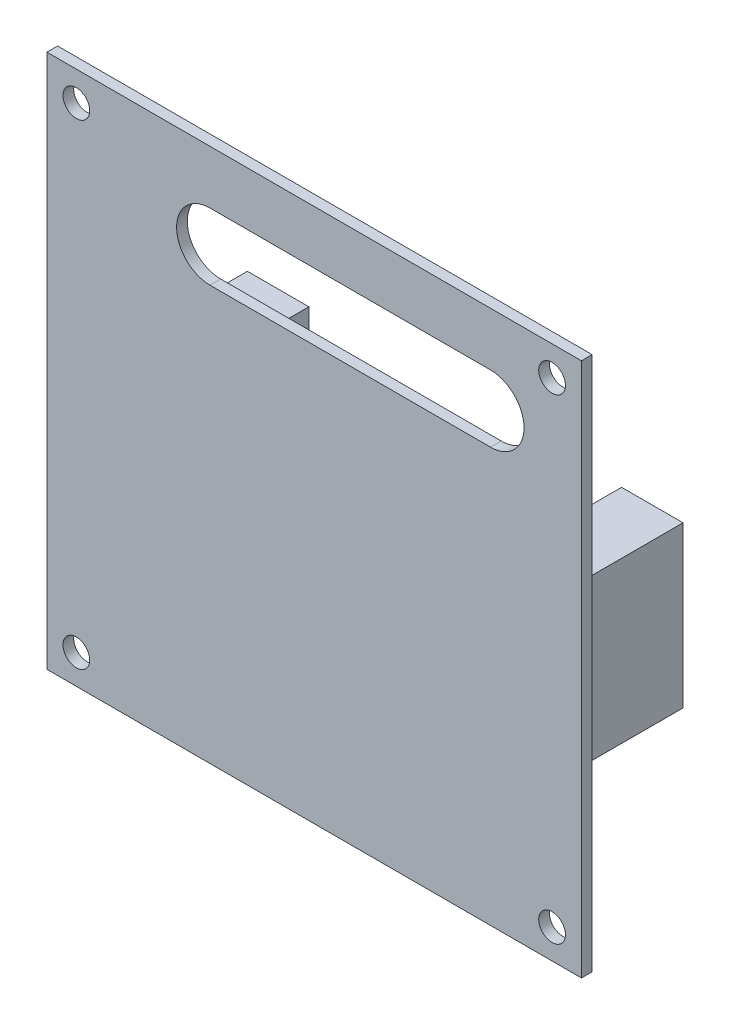
ISO-10303-21;
HEADER;
FILE_DESCRIPTION(('STEP AP214'),'2;1');
FILE_NAME('part.step','',(''),(''),'','','');
FILE_SCHEMA(('AUTOMOTIVE_DESIGN { 1 0 10303 214 1 1 1 1 }'));
ENDSEC;
DATA;
#1=APPLICATION_CONTEXT('core data for automotive mechanical design processes');
#2=APPLICATION_PROTOCOL_DEFINITION('international standard','automotive_design',2000,#1);
#3=PRODUCT_CONTEXT('',#1,'mechanical');
#4=PRODUCT('Part','Part','',(#3));
#5=PRODUCT_RELATED_PRODUCT_CATEGORY('part','',(#4));
#6=PRODUCT_DEFINITION_FORMATION('','',#4);
#7=PRODUCT_DEFINITION_CONTEXT('part definition',#1,'design');
#8=PRODUCT_DEFINITION('design','',#6,#7);
#9=PRODUCT_DEFINITION_SHAPE('','',#8);
#10=(LENGTH_UNIT() NAMED_UNIT(*) SI_UNIT(.MILLI.,.METRE.));
#11=(NAMED_UNIT(*) PLANE_ANGLE_UNIT() SI_UNIT($,.RADIAN.));
#12=(NAMED_UNIT(*) SI_UNIT($,.STERADIAN.) SOLID_ANGLE_UNIT());
#13=UNCERTAINTY_MEASURE_WITH_UNIT(LENGTH_MEASURE(1.E-05),#10,'distance_accuracy_value','');
#14=(GEOMETRIC_REPRESENTATION_CONTEXT(3) GLOBAL_UNCERTAINTY_ASSIGNED_CONTEXT((#13)) GLOBAL_UNIT_ASSIGNED_CONTEXT((#10,
#11,#12)) REPRESENTATION_CONTEXT('',''));
#15=CARTESIAN_POINT('',(0.,0.,0.));
#16=DIRECTION('',(0.,0.,1.));
#17=DIRECTION('',(1.,0.,0.));
#18=AXIS2_PLACEMENT_3D('',#15,#16,#17);
#19=CARTESIAN_POINT('',(0.,19.93096292877,0.8));
#20=DIRECTION('',(0.,-1.,0.));
#21=DIRECTION('',(1.,0.,0.));
#22=AXIS2_PLACEMENT_3D('',#19,#20,#21);
#23=PLANE('',#22);
#24=DIRECTION('',(-1.,0.,0.));
#25=VECTOR('',#24,1.);
#26=CARTESIAN_POINT('',(0.,19.93096292877,0.));
#27=LINE('',#26,#25);
#28=CARTESIAN_POINT('',(20.0625520294404,19.93096292877,0.));
#29=VERTEX_POINT('',#28);
#30=CARTESIAN_POINT('',(-19.9374479705597,19.93096292877,0.));
#31=VERTEX_POINT('',#30);
#32=EDGE_CURVE('E279',#29,#31,#27,.T.);
#33=ORIENTED_EDGE('',*,*,#32,.T.);
#34=DIRECTION('',(0.,0.,-1.));
#35=VECTOR('',#34,1.);
#36=CARTESIAN_POINT('',(-19.9374479705597,19.93096292877,0.8));
#37=LINE('',#36,#35);
#38=CARTESIAN_POINT('',(-19.9374479705597,19.93096292877,0.8));
#39=VERTEX_POINT('',#38);
#40=EDGE_CURVE('E295',#39,#31,#37,.T.);
#41=ORIENTED_EDGE('',*,*,#40,.F.);
#42=DIRECTION('',(-1.,0.,0.));
#43=VECTOR('',#42,1.);
#44=CARTESIAN_POINT('',(0.,19.93096292877,0.8));
#45=LINE('',#44,#43);
#46=CARTESIAN_POINT('',(20.0625520294404,19.93096292877,0.8));
#47=VERTEX_POINT('',#46);
#48=EDGE_CURVE('E258',#47,#39,#45,.T.);
#49=ORIENTED_EDGE('',*,*,#48,.F.);
#50=DIRECTION('',(0.,0.,-1.));
#51=VECTOR('',#50,1.);
#52=CARTESIAN_POINT('',(20.0625520294404,19.93096292877,0.8));
#53=LINE('',#52,#51);
#54=EDGE_CURVE('E267',#47,#29,#53,.T.);
#55=ORIENTED_EDGE('',*,*,#54,.T.);
#56=EDGE_LOOP('',(#33,#41,#49,#55));
#57=FACE_BOUND('',#56,.T.);
#58=ADVANCED_FACE('F38',(#57),#23,.F.);
#59=CARTESIAN_POINT('',(-19.9374479705597,0.,0.8));
#60=DIRECTION('',(1.,0.,0.));
#61=DIRECTION('',(0.,1.,0.));
#62=AXIS2_PLACEMENT_3D('',#59,#60,#61);
#63=PLANE('',#62);
#64=DIRECTION('',(0.,-1.,0.));
#65=VECTOR('',#64,1.);
#66=CARTESIAN_POINT('',(-19.9374479705597,0.,0.));
#67=LINE('',#66,#65);
#68=CARTESIAN_POINT('',(-19.9374479705597,-20.06903707123,0.));
#69=VERTEX_POINT('',#68);
#70=EDGE_CURVE('E282',#31,#69,#67,.T.);
#71=ORIENTED_EDGE('',*,*,#70,.T.);
#72=DIRECTION('',(0.,0.,-1.));
#73=VECTOR('',#72,1.);
#74=CARTESIAN_POINT('',(-19.9374479705597,-20.06903707123,0.8));
#75=LINE('',#74,#73);
#76=CARTESIAN_POINT('',(-19.9374479705597,-20.06903707123,0.8));
#77=VERTEX_POINT('',#76);
#78=EDGE_CURVE('E292',#77,#69,#75,.T.);
#79=ORIENTED_EDGE('',*,*,#78,.F.);
#80=DIRECTION('',(0.,-1.,0.));
#81=VECTOR('',#80,1.);
#82=CARTESIAN_POINT('',(-19.9374479705597,0.,0.8));
#83=LINE('',#82,#81);
#84=EDGE_CURVE('E261',#39,#77,#83,.T.);
#85=ORIENTED_EDGE('',*,*,#84,.F.);
#86=ORIENTED_EDGE('',*,*,#40,.T.);
#87=EDGE_LOOP('',(#71,#79,#85,#86));
#88=FACE_BOUND('',#87,.T.);
#89=ADVANCED_FACE('F345',(#88),#63,.F.);
#90=CARTESIAN_POINT('',(0.,-20.06903707123,0.8));
#91=DIRECTION('',(0.,1.,0.));
#92=DIRECTION('',(-1.,0.,0.));
#93=AXIS2_PLACEMENT_3D('',#90,#91,#92);
#94=PLANE('',#93);
#95=DIRECTION('',(1.,0.,0.));
#96=VECTOR('',#95,1.);
#97=CARTESIAN_POINT('',(0.,-20.06903707123,0.));
#98=LINE('',#97,#96);
#99=CARTESIAN_POINT('',(20.0625520294403,-20.06903707123,0.));
#100=VERTEX_POINT('',#99);
#101=EDGE_CURVE('E284',#69,#100,#98,.T.);
#102=ORIENTED_EDGE('',*,*,#101,.T.);
#103=DIRECTION('',(0.,0.,-1.));
#104=VECTOR('',#103,1.);
#105=CARTESIAN_POINT('',(20.0625520294403,-20.06903707123,0.8));
#106=LINE('',#105,#104);
#107=CARTESIAN_POINT('',(20.0625520294403,-20.06903707123,0.8));
#108=VERTEX_POINT('',#107);
#109=EDGE_CURVE('E289',#108,#100,#106,.T.);
#110=ORIENTED_EDGE('',*,*,#109,.F.);
#111=DIRECTION('',(1.,0.,0.));
#112=VECTOR('',#111,1.);
#113=CARTESIAN_POINT('',(0.,-20.06903707123,0.8));
#114=LINE('',#113,#112);
#115=EDGE_CURVE('E263',#77,#108,#114,.T.);
#116=ORIENTED_EDGE('',*,*,#115,.F.);
#117=ORIENTED_EDGE('',*,*,#78,.T.);
#118=EDGE_LOOP('',(#102,#110,#116,#117));
#119=FACE_BOUND('',#118,.T.);
#120=ADVANCED_FACE('F351',(#119),#94,.F.);
#121=CARTESIAN_POINT('',(-17.7374479705597,-17.86903707123,0.8));
#122=DIRECTION('',(0.,0.,-1.));
#123=DIRECTION('',(-1.,0.,0.));
#124=AXIS2_PLACEMENT_3D('',#121,#122,#123);
#125=CYLINDRICAL_SURFACE('',#124,0.999999999998721);
#126=CARTESIAN_POINT('',(-17.7374479705597,-17.86903707123,0.8));
#127=DIRECTION('',(0.,0.,1.));
#128=DIRECTION('',(1.,0.,0.));
#129=AXIS2_PLACEMENT_3D('',#126,#127,#128);
#130=CIRCLE('',#129,0.999999999998721);
#131=CARTESIAN_POINT('',(-16.7374479705609,-17.86903707123,0.8));
#132=VERTEX_POINT('',#131);
#133=EDGE_CURVE('E255',#132,#132,#130,.T.);
#134=ORIENTED_EDGE('',*,*,#133,.T.);
#135=EDGE_LOOP('',(#134));
#136=FACE_BOUND('',#135,.T.);
#137=CARTESIAN_POINT('',(-17.7374479705597,-17.86903707123,0.));
#138=DIRECTION('',(0.,0.,1.));
#139=DIRECTION('',(1.,0.,0.));
#140=AXIS2_PLACEMENT_3D('',#137,#138,#139);
#141=CIRCLE('',#140,0.999999999998721);
#142=CARTESIAN_POINT('',(-16.7374479705609,-17.86903707123,0.));
#143=VERTEX_POINT('',#142);
#144=EDGE_CURVE('E276',#143,#143,#141,.T.);
#145=ORIENTED_EDGE('',*,*,#144,.F.);
#146=EDGE_LOOP('',(#145));
#147=FACE_BOUND('',#146,.T.);
#148=ADVANCED_FACE('F356',(#136,#147),#125,.F.);
#149=CARTESIAN_POINT('',(-17.7374479705597,17.73096292877,0.8));
#150=DIRECTION('',(0.,0.,-1.));
#151=DIRECTION('',(-1.,0.,0.));
#152=AXIS2_PLACEMENT_3D('',#149,#150,#151);
#153=CYLINDRICAL_SURFACE('',#152,0.999999999998721);
#154=CARTESIAN_POINT('',(-17.7374479705597,17.73096292877,0.8));
#155=DIRECTION('',(0.,0.,1.));
#156=DIRECTION('',(1.,0.,0.));
#157=AXIS2_PLACEMENT_3D('',#154,#155,#156);
#158=CIRCLE('',#157,0.999999999998721);
#159=CARTESIAN_POINT('',(-16.737447970561,17.73096292877,0.8));
#160=VERTEX_POINT('',#159);
#161=EDGE_CURVE('E252',#160,#160,#158,.T.);
#162=ORIENTED_EDGE('',*,*,#161,.T.);
#163=EDGE_LOOP('',(#162));
#164=FACE_BOUND('',#163,.T.);
#165=CARTESIAN_POINT('',(-17.7374479705597,17.73096292877,0.));
#166=DIRECTION('',(0.,0.,1.));
#167=DIRECTION('',(1.,0.,0.));
#168=AXIS2_PLACEMENT_3D('',#165,#166,#167);
#169=CIRCLE('',#168,0.999999999998721);
#170=CARTESIAN_POINT('',(-16.737447970561,17.73096292877,0.));
#171=VERTEX_POINT('',#170);
#172=EDGE_CURVE('E273',#171,#171,#169,.T.);
#173=ORIENTED_EDGE('',*,*,#172,.F.);
#174=EDGE_LOOP('',(#173));
#175=FACE_BOUND('',#174,.T.);
#176=ADVANCED_FACE('F359',(#164,#175),#153,.F.);
#177=CARTESIAN_POINT('',(17.8625520294403,17.73096292877,0.8));
#178=DIRECTION('',(0.,0.,-1.));
#179=DIRECTION('',(-1.,0.,0.));
#180=AXIS2_PLACEMENT_3D('',#177,#178,#179);
#181=CYLINDRICAL_SURFACE('',#180,0.999999999998735);
#182=CARTESIAN_POINT('',(17.8625520294403,17.73096292877,0.8));
#183=DIRECTION('',(0.,0.,1.));
#184=DIRECTION('',(1.,0.,0.));
#185=AXIS2_PLACEMENT_3D('',#182,#183,#184);
#186=CIRCLE('',#185,0.999999999998735);
#187=CARTESIAN_POINT('',(18.8625520294391,17.73096292877,0.8));
#188=VERTEX_POINT('',#187);
#189=EDGE_CURVE('E248',#188,#188,#186,.T.);
#190=ORIENTED_EDGE('',*,*,#189,.T.);
#191=EDGE_LOOP('',(#190));
#192=FACE_BOUND('',#191,.T.);
#193=CARTESIAN_POINT('',(17.8625520294403,17.73096292877,0.));
#194=DIRECTION('',(0.,0.,1.));
#195=DIRECTION('',(1.,0.,0.));
#196=AXIS2_PLACEMENT_3D('',#193,#194,#195);
#197=CIRCLE('',#196,0.999999999998735);
#198=CARTESIAN_POINT('',(18.8625520294391,17.73096292877,0.));
#199=VERTEX_POINT('',#198);
#200=EDGE_CURVE('E270',#199,#199,#197,.T.);
#201=ORIENTED_EDGE('',*,*,#200,.F.);
#202=EDGE_LOOP('',(#201));
#203=FACE_BOUND('',#202,.T.);
#204=ADVANCED_FACE('F362',(#192,#203),#181,.F.);
#205=CARTESIAN_POINT('',(17.8625520294404,-17.86903707123,0.8));
#206=DIRECTION('',(0.,0.,-1.));
#207=DIRECTION('',(-1.,0.,0.));
#208=AXIS2_PLACEMENT_3D('',#205,#206,#207);
#209=CYLINDRICAL_SURFACE('',#208,0.999999999998736);
#210=CARTESIAN_POINT('',(17.8625520294404,-17.86903707123,0.8));
#211=DIRECTION('',(0.,0.,1.));
#212=DIRECTION('',(1.,0.,0.));
#213=AXIS2_PLACEMENT_3D('',#210,#211,#212);
#214=CIRCLE('',#213,0.999999999998736);
#215=CARTESIAN_POINT('',(18.8625520294391,-17.86903707123,0.8));
#216=VERTEX_POINT('',#215);
#217=EDGE_CURVE('E245',#216,#216,#214,.T.);
#218=ORIENTED_EDGE('',*,*,#217,.T.);
#219=EDGE_LOOP('',(#218));
#220=FACE_BOUND('',#219,.T.);
#221=CARTESIAN_POINT('',(17.8625520294404,-17.86903707123,0.));
#222=DIRECTION('',(0.,0.,1.));
#223=DIRECTION('',(1.,0.,0.));
#224=AXIS2_PLACEMENT_3D('',#221,#222,#223);
#225=CIRCLE('',#224,0.999999999998736);
#226=CARTESIAN_POINT('',(18.8625520294391,-17.86903707123,0.));
#227=VERTEX_POINT('',#226);
#228=EDGE_CURVE('E237',#227,#227,#225,.T.);
#229=ORIENTED_EDGE('',*,*,#228,.F.);
#230=EDGE_LOOP('',(#229));
#231=FACE_BOUND('',#230,.T.);
#232=ADVANCED_FACE('F40',(#220,#231),#209,.F.);
#233=CARTESIAN_POINT('',(20.0625520294403,0.,0.8));
#234=DIRECTION('',(-1.,0.,0.));
#235=DIRECTION('',(0.,-1.,0.));
#236=AXIS2_PLACEMENT_3D('',#233,#234,#235);
#237=PLANE('',#236);
#238=DIRECTION('',(0.,1.,0.));
#239=VECTOR('',#238,1.);
#240=CARTESIAN_POINT('',(20.0625520294403,0.,0.));
#241=LINE('',#240,#239);
#242=EDGE_CURVE('E249',#100,#29,#241,.T.);
#243=ORIENTED_EDGE('',*,*,#242,.T.);
#244=ORIENTED_EDGE('',*,*,#54,.F.);
#245=DIRECTION('',(0.,1.,0.));
#246=VECTOR('',#245,1.);
#247=CARTESIAN_POINT('',(20.0625520294403,0.,0.8));
#248=LINE('',#247,#246);
#249=EDGE_CURVE('E265',#108,#47,#248,.T.);
#250=ORIENTED_EDGE('',*,*,#249,.F.);
#251=ORIENTED_EDGE('',*,*,#109,.T.);
#252=EDGE_LOOP('',(#243,#244,#250,#251));
#253=FACE_BOUND('',#252,.T.);
#254=ADVANCED_FACE('F369',(#253),#237,.F.);
#255=CARTESIAN_POINT('',(0.,0.,0.8));
#256=DIRECTION('',(0.,0.,1.));
#257=DIRECTION('',(1.,0.,0.));
#258=AXIS2_PLACEMENT_3D('',#255,#256,#257);
#259=PLANE('',#258);
#260=CARTESIAN_POINT('',(-7.73744797055969,13.43096292877,0.8));
#261=DIRECTION('',(0.,0.,1.));
#262=DIRECTION('',(1.,0.,0.));
#263=AXIS2_PLACEMENT_3D('',#260,#261,#262);
#264=CIRCLE('',#263,2.5);
#265=CARTESIAN_POINT('',(-7.73744797055969,15.93096292877,0.8));
#266=VERTEX_POINT('',#265);
#267=CARTESIAN_POINT('',(-7.73744797055969,10.93096292877,0.8));
#268=VERTEX_POINT('',#267);
#269=EDGE_CURVE('E184',#266,#268,#264,.T.);
#270=ORIENTED_EDGE('',*,*,#269,.F.);
#271=DIRECTION('',(-1.,0.,0.));
#272=VECTOR('',#271,1.);
#273=CARTESIAN_POINT('',(0.,15.93096292877,0.8));
#274=LINE('',#273,#272);
#275=CARTESIAN_POINT('',(13.2625520294403,15.93096292877,0.8));
#276=VERTEX_POINT('',#275);
#277=EDGE_CURVE('E177',#276,#266,#274,.T.);
#278=ORIENTED_EDGE('',*,*,#277,.F.);
#279=CARTESIAN_POINT('',(13.2625520294403,13.43096292877,0.8));
#280=DIRECTION('',(0.,0.,1.));
#281=DIRECTION('',(1.,0.,0.));
#282=AXIS2_PLACEMENT_3D('',#279,#280,#281);
#283=CIRCLE('',#282,2.5);
#284=CARTESIAN_POINT('',(13.2625520294403,10.93096292877,0.8));
#285=VERTEX_POINT('',#284);
#286=EDGE_CURVE('E157',#285,#276,#283,.T.);
#287=ORIENTED_EDGE('',*,*,#286,.F.);
#288=DIRECTION('',(1.,0.,0.));
#289=VECTOR('',#288,1.);
#290=CARTESIAN_POINT('',(0.,10.93096292877,0.8));
#291=LINE('',#290,#289);
#292=EDGE_CURVE('E182',#268,#285,#291,.T.);
#293=ORIENTED_EDGE('',*,*,#292,.F.);
#294=EDGE_LOOP('',(#270,#278,#287,#293));
#295=FACE_BOUND('',#294,.T.);
#296=ORIENTED_EDGE('',*,*,#217,.F.);
#297=EDGE_LOOP('',(#296));
#298=FACE_BOUND('',#297,.T.);
#299=ORIENTED_EDGE('',*,*,#189,.F.);
#300=EDGE_LOOP('',(#299));
#301=FACE_BOUND('',#300,.T.);
#302=ORIENTED_EDGE('',*,*,#161,.F.);
#303=EDGE_LOOP('',(#302));
#304=FACE_BOUND('',#303,.T.);
#305=ORIENTED_EDGE('',*,*,#133,.F.);
#306=EDGE_LOOP('',(#305));
#307=FACE_BOUND('',#306,.T.);
#308=ORIENTED_EDGE('',*,*,#48,.T.);
#309=ORIENTED_EDGE('',*,*,#84,.T.);
#310=ORIENTED_EDGE('',*,*,#115,.T.);
#311=ORIENTED_EDGE('',*,*,#249,.T.);
#312=EDGE_LOOP('',(#308,#309,#310,#311));
#313=FACE_BOUND('',#312,.T.);
#314=ADVANCED_FACE('F378',(#295,#298,#301,#304,#307,#313),#259,.T.);
#315=CARTESIAN_POINT('',(0.,0.,0.));
#316=DIRECTION('',(0.,0.,1.));
#317=DIRECTION('',(1.,0.,0.));
#318=AXIS2_PLACEMENT_3D('',#315,#316,#317);
#319=PLANE('',#318);
#320=DIRECTION('',(1.,0.,0.));
#321=VECTOR('',#320,1.);
#322=CARTESIAN_POINT('',(-7.73744797055969,15.93096292877,0.));
#323=LINE('',#322,#321);
#324=CARTESIAN_POINT('',(-7.73744797055969,15.93096292877,0.));
#325=VERTEX_POINT('',#324);
#326=CARTESIAN_POINT('',(13.2625520294403,15.93096292877,0.));
#327=VERTEX_POINT('',#326);
#328=EDGE_CURVE('E163',#325,#327,#323,.T.);
#329=ORIENTED_EDGE('',*,*,#328,.F.);
#330=CARTESIAN_POINT('',(-7.73744797055969,13.43096292877,0.));
#331=DIRECTION('',(0.,0.,-1.));
#332=DIRECTION('',(-1.,0.,0.));
#333=AXIS2_PLACEMENT_3D('',#330,#331,#332);
#334=CIRCLE('',#333,2.5);
#335=CARTESIAN_POINT('',(-7.73744797055969,10.93096292877,0.));
#336=VERTEX_POINT('',#335);
#337=EDGE_CURVE('E61',#336,#325,#334,.T.);
#338=ORIENTED_EDGE('',*,*,#337,.F.);
#339=DIRECTION('',(-1.,0.,0.));
#340=VECTOR('',#339,1.);
#341=CARTESIAN_POINT('',(-7.73744797055969,10.93096292877,0.));
#342=LINE('',#341,#340);
#343=CARTESIAN_POINT('',(13.2625520294403,10.93096292877,0.));
#344=VERTEX_POINT('',#343);
#345=EDGE_CURVE('E170',#344,#336,#342,.T.);
#346=ORIENTED_EDGE('',*,*,#345,.F.);
#347=CARTESIAN_POINT('',(13.2625520294403,13.43096292877,0.));
#348=DIRECTION('',(0.,0.,-1.));
#349=DIRECTION('',(1.,0.,0.));
#350=AXIS2_PLACEMENT_3D('',#347,#348,#349);
#351=CIRCLE('',#350,2.5);
#352=EDGE_CURVE('E154',#327,#344,#351,.T.);
#353=ORIENTED_EDGE('',*,*,#352,.F.);
#354=EDGE_LOOP('',(#329,#338,#346,#353));
#355=FACE_BOUND('',#354,.T.);
#356=DIRECTION('',(1.,0.,0.));
#357=VECTOR('',#356,1.);
#358=CARTESIAN_POINT('',(0.,-11.56903707123,0.));
#359=LINE('',#358,#357);
#360=CARTESIAN_POINT('',(-17.7374479705597,-11.56903707123,0.));
#361=VERTEX_POINT('',#360);
#362=CARTESIAN_POINT('',(-13.1374479705597,-11.56903707123,0.));
#363=VERTEX_POINT('',#362);
#364=EDGE_CURVE('E46',#361,#363,#359,.T.);
#365=ORIENTED_EDGE('',*,*,#364,.T.);
#366=DIRECTION('',(0.,1.,0.));
#367=VECTOR('',#366,1.);
#368=CARTESIAN_POINT('',(-13.1374479705597,0.,0.));
#369=LINE('',#368,#367);
#370=CARTESIAN_POINT('',(-13.1374479705597,0.430962928769985,0.));
#371=VERTEX_POINT('',#370);
#372=EDGE_CURVE('E11',#363,#371,#369,.T.);
#373=ORIENTED_EDGE('',*,*,#372,.T.);
#374=DIRECTION('',(-1.,0.,0.));
#375=VECTOR('',#374,1.);
#376=CARTESIAN_POINT('',(0.,0.430962928769987,0.));
#377=LINE('',#376,#375);
#378=CARTESIAN_POINT('',(-17.7374479705597,0.430962928769985,0.));
#379=VERTEX_POINT('',#378);
#380=EDGE_CURVE('E310',#371,#379,#377,.T.);
#381=ORIENTED_EDGE('',*,*,#380,.T.);
#382=DIRECTION('',(0.,-1.,0.));
#383=VECTOR('',#382,1.);
#384=CARTESIAN_POINT('',(-17.7374479705597,0.,0.));
#385=LINE('',#384,#383);
#386=EDGE_CURVE('E313',#379,#361,#385,.T.);
#387=ORIENTED_EDGE('',*,*,#386,.T.);
#388=EDGE_LOOP('',(#365,#373,#381,#387));
#389=FACE_BOUND('',#388,.T.);
#390=DIRECTION('',(1.,0.,0.));
#391=VECTOR('',#390,1.);
#392=CARTESIAN_POINT('',(0.,-11.56903707123,0.));
#393=LINE('',#392,#391);
#394=CARTESIAN_POINT('',(10.2625520294403,-11.56903707123,0.));
#395=VERTEX_POINT('',#394);
#396=CARTESIAN_POINT('',(14.8625520294403,-11.56903707123,0.));
#397=VERTEX_POINT('',#396);
#398=EDGE_CURVE('E304',#395,#397,#393,.T.);
#399=ORIENTED_EDGE('',*,*,#398,.T.);
#400=DIRECTION('',(0.,1.,0.));
#401=VECTOR('',#400,1.);
#402=CARTESIAN_POINT('',(14.8625520294403,0.,0.));
#403=LINE('',#402,#401);
#404=CARTESIAN_POINT('',(14.8625520294403,0.430962928769988,0.));
#405=VERTEX_POINT('',#404);
#406=EDGE_CURVE('E307',#397,#405,#403,.T.);
#407=ORIENTED_EDGE('',*,*,#406,.T.);
#408=DIRECTION('',(-1.,0.,0.));
#409=VECTOR('',#408,1.);
#410=CARTESIAN_POINT('',(0.,0.430962928769988,0.));
#411=LINE('',#410,#409);
#412=CARTESIAN_POINT('',(10.2625520294403,0.430962928769988,0.));
#413=VERTEX_POINT('',#412);
#414=EDGE_CURVE('E298',#405,#413,#411,.T.);
#415=ORIENTED_EDGE('',*,*,#414,.T.);
#416=DIRECTION('',(0.,-1.,0.));
#417=VECTOR('',#416,1.);
#418=CARTESIAN_POINT('',(10.2625520294403,0.,0.));
#419=LINE('',#418,#417);
#420=EDGE_CURVE('E301',#413,#395,#419,.T.);
#421=ORIENTED_EDGE('',*,*,#420,.T.);
#422=EDGE_LOOP('',(#399,#407,#415,#421));
#423=FACE_BOUND('',#422,.T.);
#424=ORIENTED_EDGE('',*,*,#228,.T.);
#425=EDGE_LOOP('',(#424));
#426=FACE_BOUND('',#425,.T.);
#427=ORIENTED_EDGE('',*,*,#200,.T.);
#428=EDGE_LOOP('',(#427));
#429=FACE_BOUND('',#428,.T.);
#430=ORIENTED_EDGE('',*,*,#172,.T.);
#431=EDGE_LOOP('',(#430));
#432=FACE_BOUND('',#431,.T.);
#433=ORIENTED_EDGE('',*,*,#144,.T.);
#434=EDGE_LOOP('',(#433));
#435=FACE_BOUND('',#434,.T.);
#436=ORIENTED_EDGE('',*,*,#32,.F.);
#437=ORIENTED_EDGE('',*,*,#242,.F.);
#438=ORIENTED_EDGE('',*,*,#101,.F.);
#439=ORIENTED_EDGE('',*,*,#70,.F.);
#440=EDGE_LOOP('',(#436,#437,#438,#439));
#441=FACE_BOUND('',#440,.T.);
#442=ADVANCED_FACE('F167',(#355,#389,#423,#426,#429,#432,#435,#441),#319,.F.);
#443=CARTESIAN_POINT('',(14.8625520294403,0.430962928769988,-12.));
#444=DIRECTION('',(1.,0.,0.));
#445=DIRECTION('',(0.,1.,0.));
#446=AXIS2_PLACEMENT_3D('',#443,#444,#445);
#447=PLANE('',#446);
#448=ORIENTED_EDGE('',*,*,#406,.F.);
#449=DIRECTION('',(0.,0.,1.));
#450=VECTOR('',#449,1.);
#451=CARTESIAN_POINT('',(14.8625520294403,-11.56903707123,-12.));
#452=LINE('',#451,#450);
#453=CARTESIAN_POINT('',(14.8625520294403,-11.56903707123,-12.));
#454=VERTEX_POINT('',#453);
#455=EDGE_CURVE('E234',#454,#397,#452,.T.);
#456=ORIENTED_EDGE('',*,*,#455,.F.);
#457=DIRECTION('',(0.,1.,0.));
#458=VECTOR('',#457,1.);
#459=CARTESIAN_POINT('',(14.8625520294403,0.430962928769988,-12.));
#460=LINE('',#459,#458);
#461=CARTESIAN_POINT('',(14.8625520294403,0.430962928769988,-12.));
#462=VERTEX_POINT('',#461);
#463=EDGE_CURVE('E221',#454,#462,#460,.T.);
#464=ORIENTED_EDGE('',*,*,#463,.T.);
#465=DIRECTION('',(0.,0.,1.));
#466=VECTOR('',#465,1.);
#467=CARTESIAN_POINT('',(14.8625520294403,0.430962928769988,-12.));
#468=LINE('',#467,#466);
#469=EDGE_CURVE('E233',#462,#405,#468,.T.);
#470=ORIENTED_EDGE('',*,*,#469,.T.);
#471=EDGE_LOOP('',(#448,#456,#464,#470));
#472=FACE_BOUND('',#471,.T.);
#473=ADVANCED_FACE('F377',(#472),#447,.T.);
#474=CARTESIAN_POINT('',(10.2625520294403,-11.56903707123,-12.));
#475=DIRECTION('',(0.,-1.,0.));
#476=DIRECTION('',(0.,0.,-1.));
#477=AXIS2_PLACEMENT_3D('',#474,#475,#476);
#478=PLANE('',#477);
#479=ORIENTED_EDGE('',*,*,#398,.F.);
#480=DIRECTION('',(0.,0.,1.));
#481=VECTOR('',#480,1.);
#482=CARTESIAN_POINT('',(10.2625520294403,-11.56903707123,-12.));
#483=LINE('',#482,#481);
#484=CARTESIAN_POINT('',(10.2625520294403,-11.56903707123,-12.));
#485=VERTEX_POINT('',#484);
#486=EDGE_CURVE('E238',#485,#395,#483,.T.);
#487=ORIENTED_EDGE('',*,*,#486,.F.);
#488=DIRECTION('',(1.,0.,0.));
#489=VECTOR('',#488,1.);
#490=CARTESIAN_POINT('',(10.2625520294403,-11.56903707123,-12.));
#491=LINE('',#490,#489);
#492=EDGE_CURVE('E230',#485,#454,#491,.T.);
#493=ORIENTED_EDGE('',*,*,#492,.T.);
#494=ORIENTED_EDGE('',*,*,#455,.T.);
#495=EDGE_LOOP('',(#479,#487,#493,#494));
#496=FACE_BOUND('',#495,.T.);
#497=ADVANCED_FACE('F451',(#496),#478,.T.);
#498=CARTESIAN_POINT('',(10.2625520294403,0.430962928769988,-12.));
#499=DIRECTION('',(-1.,0.,0.));
#500=DIRECTION('',(0.,0.,1.));
#501=AXIS2_PLACEMENT_3D('',#498,#499,#500);
#502=PLANE('',#501);
#503=ORIENTED_EDGE('',*,*,#420,.F.);
#504=DIRECTION('',(0.,0.,1.));
#505=VECTOR('',#504,1.);
#506=CARTESIAN_POINT('',(10.2625520294403,0.430962928769988,-12.));
#507=LINE('',#506,#505);
#508=CARTESIAN_POINT('',(10.2625520294403,0.430962928769988,-12.));
#509=VERTEX_POINT('',#508);
#510=EDGE_CURVE('E241',#509,#413,#507,.T.);
#511=ORIENTED_EDGE('',*,*,#510,.F.);
#512=DIRECTION('',(0.,-1.,0.));
#513=VECTOR('',#512,1.);
#514=CARTESIAN_POINT('',(10.2625520294403,0.430962928769988,-12.));
#515=LINE('',#514,#513);
#516=EDGE_CURVE('E227',#509,#485,#515,.T.);
#517=ORIENTED_EDGE('',*,*,#516,.T.);
#518=ORIENTED_EDGE('',*,*,#486,.T.);
#519=EDGE_LOOP('',(#503,#511,#517,#518));
#520=FACE_BOUND('',#519,.T.);
#521=ADVANCED_FACE('F462',(#520),#502,.T.);
#522=CARTESIAN_POINT('',(10.2625520294403,0.430962928769988,-12.));
#523=DIRECTION('',(0.,1.,0.));
#524=DIRECTION('',(0.,0.,1.));
#525=AXIS2_PLACEMENT_3D('',#522,#523,#524);
#526=PLANE('',#525);
#527=CARTESIAN_POINT('',(12.5625520294403,0.430962928769988,-6.2));
#528=DIRECTION('',(0.,1.,0.));
#529=DIRECTION('',(-1.,0.,0.));
#530=AXIS2_PLACEMENT_3D('',#527,#528,#529);
#531=CIRCLE('',#530,0.6);
#532=CARTESIAN_POINT('',(11.9625520294403,0.430962928769988,-6.2));
#533=VERTEX_POINT('',#532);
#534=EDGE_CURVE('E194',#533,#533,#531,.T.);
#535=ORIENTED_EDGE('',*,*,#534,.F.);
#536=EDGE_LOOP('',(#535));
#537=FACE_BOUND('',#536,.T.);
#538=ORIENTED_EDGE('',*,*,#414,.F.);
#539=ORIENTED_EDGE('',*,*,#469,.F.);
#540=DIRECTION('',(-1.,0.,0.));
#541=VECTOR('',#540,1.);
#542=CARTESIAN_POINT('',(10.2625520294403,0.430962928769988,-12.));
#543=LINE('',#542,#541);
#544=EDGE_CURVE('E224',#462,#509,#543,.T.);
#545=ORIENTED_EDGE('',*,*,#544,.T.);
#546=ORIENTED_EDGE('',*,*,#510,.T.);
#547=EDGE_LOOP('',(#538,#539,#545,#546));
#548=FACE_BOUND('',#547,.T.);
#549=ADVANCED_FACE('F473',(#537,#548),#526,.T.);
#550=CARTESIAN_POINT('',(0.,0.,-12.));
#551=DIRECTION('',(0.,0.,1.));
#552=DIRECTION('',(1.,0.,0.));
#553=AXIS2_PLACEMENT_3D('',#550,#551,#552);
#554=PLANE('',#553);
#555=ORIENTED_EDGE('',*,*,#463,.F.);
#556=ORIENTED_EDGE('',*,*,#492,.F.);
#557=ORIENTED_EDGE('',*,*,#516,.F.);
#558=ORIENTED_EDGE('',*,*,#544,.F.);
#559=EDGE_LOOP('',(#555,#556,#557,#558));
#560=FACE_BOUND('',#559,.T.);
#561=ADVANCED_FACE('F482',(#560),#554,.F.);
#562=CARTESIAN_POINT('',(-13.1374479705597,0.430962928769985,-12.));
#563=DIRECTION('',(1.,0.,0.));
#564=DIRECTION('',(0.,0.,-1.));
#565=AXIS2_PLACEMENT_3D('',#562,#563,#564);
#566=PLANE('',#565);
#567=ORIENTED_EDGE('',*,*,#372,.F.);
#568=DIRECTION('',(0.,0.,1.));
#569=VECTOR('',#568,1.);
#570=CARTESIAN_POINT('',(-13.1374479705597,-11.56903707123,-12.));
#571=LINE('',#570,#569);
#572=CARTESIAN_POINT('',(-13.1374479705597,-11.56903707123,-12.));
#573=VERTEX_POINT('',#572);
#574=EDGE_CURVE('E190',#573,#363,#571,.T.);
#575=ORIENTED_EDGE('',*,*,#574,.F.);
#576=DIRECTION('',(0.,1.,0.));
#577=VECTOR('',#576,1.);
#578=CARTESIAN_POINT('',(-13.1374479705597,0.430962928769985,-12.));
#579=LINE('',#578,#577);
#580=CARTESIAN_POINT('',(-13.1374479705597,0.430962928769985,-12.));
#581=VERTEX_POINT('',#580);
#582=EDGE_CURVE('E218',#573,#581,#579,.T.);
#583=ORIENTED_EDGE('',*,*,#582,.T.);
#584=DIRECTION('',(0.,0.,1.));
#585=VECTOR('',#584,1.);
#586=CARTESIAN_POINT('',(-13.1374479705597,0.430962928769985,-12.));
#587=LINE('',#586,#585);
#588=EDGE_CURVE('E199',#581,#371,#587,.T.);
#589=ORIENTED_EDGE('',*,*,#588,.T.);
#590=EDGE_LOOP('',(#567,#575,#583,#589));
#591=FACE_BOUND('',#590,.T.);
#592=ADVANCED_FACE('F329',(#591),#566,.T.);
#593=CARTESIAN_POINT('',(-13.1374479705597,-11.56903707123,-12.));
#594=DIRECTION('',(0.,-1.,0.));
#595=DIRECTION('',(0.,0.,-1.));
#596=AXIS2_PLACEMENT_3D('',#593,#594,#595);
#597=PLANE('',#596);
#598=ORIENTED_EDGE('',*,*,#364,.F.);
#599=DIRECTION('',(0.,0.,1.));
#600=VECTOR('',#599,1.);
#601=CARTESIAN_POINT('',(-17.7374479705597,-11.56903707123,-12.));
#602=LINE('',#601,#600);
#603=CARTESIAN_POINT('',(-17.7374479705597,-11.56903707123,-12.));
#604=VERTEX_POINT('',#603);
#605=EDGE_CURVE('E205',#604,#361,#602,.T.);
#606=ORIENTED_EDGE('',*,*,#605,.F.);
#607=DIRECTION('',(1.,0.,0.));
#608=VECTOR('',#607,1.);
#609=CARTESIAN_POINT('',(-13.1374479705597,-11.56903707123,-12.));
#610=LINE('',#609,#608);
#611=EDGE_CURVE('E202',#604,#573,#610,.T.);
#612=ORIENTED_EDGE('',*,*,#611,.T.);
#613=ORIENTED_EDGE('',*,*,#574,.T.);
#614=EDGE_LOOP('',(#598,#606,#612,#613));
#615=FACE_BOUND('',#614,.T.);
#616=ADVANCED_FACE('F319',(#615),#597,.T.);
#617=CARTESIAN_POINT('',(-17.7374479705597,0.430962928769985,-12.));
#618=DIRECTION('',(-1.,0.,0.));
#619=DIRECTION('',(0.,-1.,0.));
#620=AXIS2_PLACEMENT_3D('',#617,#618,#619);
#621=PLANE('',#620);
#622=ORIENTED_EDGE('',*,*,#386,.F.);
#623=DIRECTION('',(0.,0.,1.));
#624=VECTOR('',#623,1.);
#625=CARTESIAN_POINT('',(-17.7374479705597,0.430962928769985,-12.));
#626=LINE('',#625,#624);
#627=CARTESIAN_POINT('',(-17.7374479705597,0.430962928769985,-12.));
#628=VERTEX_POINT('',#627);
#629=EDGE_CURVE('E203',#628,#379,#626,.T.);
#630=ORIENTED_EDGE('',*,*,#629,.F.);
#631=DIRECTION('',(0.,-1.,0.));
#632=VECTOR('',#631,1.);
#633=CARTESIAN_POINT('',(-17.7374479705597,0.430962928769985,-12.));
#634=LINE('',#633,#632);
#635=EDGE_CURVE('E212',#628,#604,#634,.T.);
#636=ORIENTED_EDGE('',*,*,#635,.T.);
#637=ORIENTED_EDGE('',*,*,#605,.T.);
#638=EDGE_LOOP('',(#622,#630,#636,#637));
#639=FACE_BOUND('',#638,.T.);
#640=ADVANCED_FACE('F321',(#639),#621,.T.);
#641=CARTESIAN_POINT('',(-13.1374479705597,0.430962928769985,-12.));
#642=DIRECTION('',(0.,1.,0.));
#643=DIRECTION('',(-1.,0.,0.));
#644=AXIS2_PLACEMENT_3D('',#641,#642,#643);
#645=PLANE('',#644);
#646=CARTESIAN_POINT('',(-15.4374479705597,0.430962928769985,-6.2));
#647=DIRECTION('',(0.,1.,0.));
#648=DIRECTION('',(-1.,0.,0.));
#649=AXIS2_PLACEMENT_3D('',#646,#647,#648);
#650=CIRCLE('',#649,0.6);
#651=CARTESIAN_POINT('',(-16.0374479705597,0.430962928769985,-6.2));
#652=VERTEX_POINT('',#651);
#653=EDGE_CURVE('E191',#652,#652,#650,.T.);
#654=ORIENTED_EDGE('',*,*,#653,.F.);
#655=EDGE_LOOP('',(#654));
#656=FACE_BOUND('',#655,.T.);
#657=ORIENTED_EDGE('',*,*,#380,.F.);
#658=ORIENTED_EDGE('',*,*,#588,.F.);
#659=DIRECTION('',(-1.,0.,0.));
#660=VECTOR('',#659,1.);
#661=CARTESIAN_POINT('',(-13.1374479705597,0.430962928769985,-12.));
#662=LINE('',#661,#660);
#663=EDGE_CURVE('E215',#581,#628,#662,.T.);
#664=ORIENTED_EDGE('',*,*,#663,.T.);
#665=ORIENTED_EDGE('',*,*,#629,.T.);
#666=EDGE_LOOP('',(#657,#658,#664,#665));
#667=FACE_BOUND('',#666,.T.);
#668=ADVANCED_FACE('F331',(#656,#667),#645,.T.);
#669=CARTESIAN_POINT('',(0.,0.,-12.));
#670=DIRECTION('',(0.,0.,-1.));
#671=DIRECTION('',(-1.,0.,0.));
#672=AXIS2_PLACEMENT_3D('',#669,#670,#671);
#673=PLANE('',#672);
#674=ORIENTED_EDGE('',*,*,#582,.F.);
#675=ORIENTED_EDGE('',*,*,#611,.F.);
#676=ORIENTED_EDGE('',*,*,#635,.F.);
#677=ORIENTED_EDGE('',*,*,#663,.F.);
#678=EDGE_LOOP('',(#674,#675,#676,#677));
#679=FACE_BOUND('',#678,.T.);
#680=ADVANCED_FACE('F327',(#679),#673,.T.);
#681=CARTESIAN_POINT('',(-15.4374479705597,-5.56903707123001,-6.2));
#682=DIRECTION('',(0.,1.,0.));
#683=DIRECTION('',(-1.,0.,0.));
#684=AXIS2_PLACEMENT_3D('',#681,#682,#683);
#685=CYLINDRICAL_SURFACE('',#684,0.6);
#686=CARTESIAN_POINT('',(-15.4374479705597,-5.56903707123001,-6.2));
#687=DIRECTION('',(0.,1.,0.));
#688=DIRECTION('',(-1.,0.,0.));
#689=AXIS2_PLACEMENT_3D('',#686,#687,#688);
#690=CIRCLE('',#689,0.6);
#691=CARTESIAN_POINT('',(-16.0374479705597,-5.56903707123001,-6.2));
#692=VERTEX_POINT('',#691);
#693=EDGE_CURVE('E187',#692,#692,#690,.T.);
#694=ORIENTED_EDGE('',*,*,#693,.F.);
#695=EDGE_LOOP('',(#694));
#696=FACE_BOUND('',#695,.T.);
#697=ORIENTED_EDGE('',*,*,#653,.T.);
#698=EDGE_LOOP('',(#697));
#699=FACE_BOUND('',#698,.T.);
#700=ADVANCED_FACE('F339',(#696,#699),#685,.F.);
#701=CARTESIAN_POINT('',(-15.4374479705597,-5.56903707123001,-6.2));
#702=DIRECTION('',(0.,1.,0.));
#703=DIRECTION('',(-1.,0.,0.));
#704=AXIS2_PLACEMENT_3D('',#701,#702,#703);
#705=PLANE('',#704);
#706=ORIENTED_EDGE('',*,*,#693,.T.);
#707=EDGE_LOOP('',(#706));
#708=FACE_BOUND('',#707,.T.);
#709=ADVANCED_FACE('F540',(#708),#705,.T.);
#710=CARTESIAN_POINT('',(12.5625520294403,-5.56903707123001,-6.2));
#711=DIRECTION('',(0.,1.,0.));
#712=DIRECTION('',(-1.,0.,0.));
#713=AXIS2_PLACEMENT_3D('',#710,#711,#712);
#714=CYLINDRICAL_SURFACE('',#713,0.6);
#715=CARTESIAN_POINT('',(12.5625520294403,-5.56903707123001,-6.2));
#716=DIRECTION('',(0.,1.,0.));
#717=DIRECTION('',(-1.,0.,0.));
#718=AXIS2_PLACEMENT_3D('',#715,#716,#717);
#719=CIRCLE('',#718,0.6);
#720=CARTESIAN_POINT('',(11.9625520294403,-5.56903707123001,-6.2));
#721=VERTEX_POINT('',#720);
#722=EDGE_CURVE('E186',#721,#721,#719,.T.);
#723=ORIENTED_EDGE('',*,*,#722,.F.);
#724=EDGE_LOOP('',(#723));
#725=FACE_BOUND('',#724,.T.);
#726=ORIENTED_EDGE('',*,*,#534,.T.);
#727=EDGE_LOOP('',(#726));
#728=FACE_BOUND('',#727,.T.);
#729=ADVANCED_FACE('F551',(#725,#728),#714,.F.);
#730=CARTESIAN_POINT('',(12.5625520294403,-5.56903707123001,-6.2));
#731=DIRECTION('',(0.,1.,0.));
#732=DIRECTION('',(-1.,0.,0.));
#733=AXIS2_PLACEMENT_3D('',#730,#731,#732);
#734=PLANE('',#733);
#735=ORIENTED_EDGE('',*,*,#722,.T.);
#736=EDGE_LOOP('',(#735));
#737=FACE_BOUND('',#736,.T.);
#738=ADVANCED_FACE('F562',(#737),#734,.T.);
#739=CARTESIAN_POINT('',(-7.73744797055969,13.43096292877,6.));
#740=DIRECTION('',(0.,0.,-1.));
#741=DIRECTION('',(-1.,0.,0.));
#742=AXIS2_PLACEMENT_3D('',#739,#740,#741);
#743=CYLINDRICAL_SURFACE('',#742,2.5);
#744=ORIENTED_EDGE('',*,*,#269,.T.);
#745=DIRECTION('',(0.,0.,-1.));
#746=VECTOR('',#745,1.);
#747=CARTESIAN_POINT('',(-7.73744797055969,10.93096292877,6.));
#748=LINE('',#747,#746);
#749=EDGE_CURVE('E175',#268,#336,#748,.T.);
#750=ORIENTED_EDGE('',*,*,#749,.T.);
#751=ORIENTED_EDGE('',*,*,#337,.T.);
#752=DIRECTION('',(0.,0.,-1.));
#753=VECTOR('',#752,1.);
#754=CARTESIAN_POINT('',(-7.73744797055969,15.93096292877,6.));
#755=LINE('',#754,#753);
#756=EDGE_CURVE('E160',#266,#325,#755,.T.);
#757=ORIENTED_EDGE('',*,*,#756,.F.);
#758=EDGE_LOOP('',(#744,#750,#751,#757));
#759=FACE_BOUND('',#758,.T.);
#760=ADVANCED_FACE('F572',(#759),#743,.F.);
#761=CARTESIAN_POINT('',(-7.73744797055969,10.93096292877,6.));
#762=DIRECTION('',(0.,-1.,0.));
#763=DIRECTION('',(0.,0.,-1.));
#764=AXIS2_PLACEMENT_3D('',#761,#762,#763);
#765=PLANE('',#764);
#766=ORIENTED_EDGE('',*,*,#292,.T.);
#767=DIRECTION('',(0.,0.,-1.));
#768=VECTOR('',#767,1.);
#769=CARTESIAN_POINT('',(13.2625520294403,10.93096292877,6.));
#770=LINE('',#769,#768);
#771=EDGE_CURVE('E159',#285,#344,#770,.T.);
#772=ORIENTED_EDGE('',*,*,#771,.T.);
#773=ORIENTED_EDGE('',*,*,#345,.T.);
#774=ORIENTED_EDGE('',*,*,#749,.F.);
#775=EDGE_LOOP('',(#766,#772,#773,#774));
#776=FACE_BOUND('',#775,.T.);
#777=ADVANCED_FACE('F594',(#776),#765,.F.);
#778=CARTESIAN_POINT('',(13.2625520294403,13.43096292877,6.));
#779=DIRECTION('',(0.,0.,-1.));
#780=DIRECTION('',(-1.,0.,0.));
#781=AXIS2_PLACEMENT_3D('',#778,#779,#780);
#782=CYLINDRICAL_SURFACE('',#781,2.5);
#783=ORIENTED_EDGE('',*,*,#286,.T.);
#784=DIRECTION('',(0.,0.,-1.));
#785=VECTOR('',#784,1.);
#786=CARTESIAN_POINT('',(13.2625520294403,15.93096292877,6.));
#787=LINE('',#786,#785);
#788=EDGE_CURVE('E53',#276,#327,#787,.T.);
#789=ORIENTED_EDGE('',*,*,#788,.T.);
#790=ORIENTED_EDGE('',*,*,#352,.T.);
#791=ORIENTED_EDGE('',*,*,#771,.F.);
#792=EDGE_LOOP('',(#783,#789,#790,#791));
#793=FACE_BOUND('',#792,.T.);
#794=ADVANCED_FACE('F151',(#793),#782,.F.);
#795=CARTESIAN_POINT('',(-7.73744797055969,15.93096292877,6.));
#796=DIRECTION('',(0.,1.,0.));
#797=DIRECTION('',(-1.,0.,0.));
#798=AXIS2_PLACEMENT_3D('',#795,#796,#797);
#799=PLANE('',#798);
#800=ORIENTED_EDGE('',*,*,#277,.T.);
#801=ORIENTED_EDGE('',*,*,#756,.T.);
#802=ORIENTED_EDGE('',*,*,#328,.T.);
#803=ORIENTED_EDGE('',*,*,#788,.F.);
#804=EDGE_LOOP('',(#800,#801,#802,#803));
#805=FACE_BOUND('',#804,.T.);
#806=ADVANCED_FACE('F164',(#805),#799,.F.);
#807=CLOSED_SHELL('',(#58,#89,#120,#148,#176,#204,#232,#254,#314,#442,#473,#497,#521,#549,#561,
#592,#616,#640,#668,#680,#700,#709,#729,#738,#760,#777,#794,#806));
#808=MANIFOLD_SOLID_BREP('B2',#807);
#809=ADVANCED_BREP_SHAPE_REPRESENTATION('',(#18,#808),#14);
#810=SHAPE_DEFINITION_REPRESENTATION(#9,#809);
ENDSEC;
END-ISO-10303-21;
